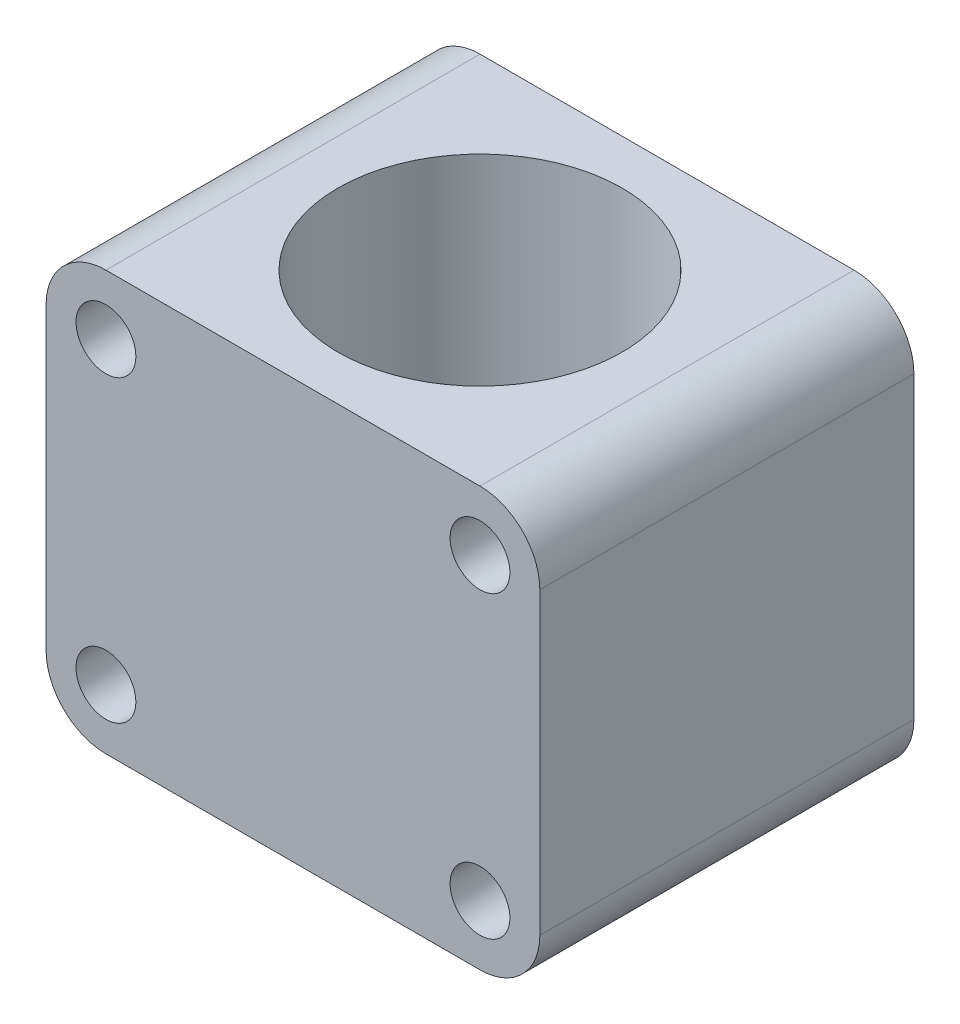
ISO-10303-21;
HEADER;
FILE_DESCRIPTION(('STEP AP214'),'2;1');
FILE_NAME('part.step','',(''),(''),'','','');
FILE_SCHEMA(('AUTOMOTIVE_DESIGN { 1 0 10303 214 1 1 1 1 }'));
ENDSEC;
DATA;
#1=APPLICATION_CONTEXT('core data for automotive mechanical design processes');
#2=APPLICATION_PROTOCOL_DEFINITION('international standard','automotive_design',2000,#1);
#3=PRODUCT_CONTEXT('',#1,'mechanical');
#4=PRODUCT('Part','Part','',(#3));
#5=PRODUCT_RELATED_PRODUCT_CATEGORY('part','',(#4));
#6=PRODUCT_DEFINITION_FORMATION('','',#4);
#7=PRODUCT_DEFINITION_CONTEXT('part definition',#1,'design');
#8=PRODUCT_DEFINITION('design','',#6,#7);
#9=PRODUCT_DEFINITION_SHAPE('','',#8);
#10=(LENGTH_UNIT() NAMED_UNIT(*) SI_UNIT(.MILLI.,.METRE.));
#11=(NAMED_UNIT(*) PLANE_ANGLE_UNIT() SI_UNIT($,.RADIAN.));
#12=(NAMED_UNIT(*) SI_UNIT($,.STERADIAN.) SOLID_ANGLE_UNIT());
#13=UNCERTAINTY_MEASURE_WITH_UNIT(LENGTH_MEASURE(1.E-05),#10,'distance_accuracy_value','');
#14=(GEOMETRIC_REPRESENTATION_CONTEXT(3) GLOBAL_UNCERTAINTY_ASSIGNED_CONTEXT((#13)) GLOBAL_UNIT_ASSIGNED_CONTEXT((#10,
#11,#12)) REPRESENTATION_CONTEXT('',''));
#15=CARTESIAN_POINT('',(0.,0.,0.));
#16=DIRECTION('',(0.,0.,1.));
#17=DIRECTION('',(1.,0.,0.));
#18=AXIS2_PLACEMENT_3D('',#15,#16,#17);
#19=CARTESIAN_POINT('',(0.,0.,25.));
#20=DIRECTION('',(0.,0.,1.));
#21=DIRECTION('',(1.,0.,0.));
#22=AXIS2_PLACEMENT_3D('',#19,#20,#21);
#23=PLANE('',#22);
#24=CARTESIAN_POINT('',(-12.5,10.,25.));
#25=DIRECTION('',(0.,0.,1.));
#26=DIRECTION('',(1.,0.,0.));
#27=AXIS2_PLACEMENT_3D('',#24,#25,#26);
#28=CIRCLE('',#27,2.);
#29=CARTESIAN_POINT('',(-10.5,10.,25.));
#30=VERTEX_POINT('',#29);
#31=EDGE_CURVE('E192',#30,#30,#28,.T.);
#32=ORIENTED_EDGE('',*,*,#31,.F.);
#33=EDGE_LOOP('',(#32));
#34=FACE_BOUND('',#33,.T.);
#35=CARTESIAN_POINT('',(12.5,-10.,25.));
#36=DIRECTION('',(0.,0.,1.));
#37=DIRECTION('',(1.,0.,0.));
#38=AXIS2_PLACEMENT_3D('',#35,#36,#37);
#39=CIRCLE('',#38,2.);
#40=CARTESIAN_POINT('',(14.5,-10.,25.));
#41=VERTEX_POINT('',#40);
#42=EDGE_CURVE('E176',#41,#41,#39,.T.);
#43=ORIENTED_EDGE('',*,*,#42,.F.);
#44=EDGE_LOOP('',(#43));
#45=FACE_BOUND('',#44,.T.);
#46=DIRECTION('',(0.,-1.,0.));
#47=VECTOR('',#46,1.);
#48=CARTESIAN_POINT('',(-16.5,14.,25.));
#49=LINE('',#48,#47);
#50=CARTESIAN_POINT('',(-16.5,9.99999999999999,25.));
#51=VERTEX_POINT('',#50);
#52=CARTESIAN_POINT('',(-16.5,-10.,25.));
#53=VERTEX_POINT('',#52);
#54=EDGE_CURVE('E180',#51,#53,#49,.T.);
#55=ORIENTED_EDGE('',*,*,#54,.T.);
#56=CARTESIAN_POINT('',(-12.5,-10.,25.));
#57=DIRECTION('',(0.,0.,1.));
#58=DIRECTION('',(1.,0.,0.));
#59=AXIS2_PLACEMENT_3D('',#56,#57,#58);
#60=CIRCLE('',#59,4.);
#61=CARTESIAN_POINT('',(-12.5,-14.,25.));
#62=VERTEX_POINT('',#61);
#63=EDGE_CURVE('E157',#53,#62,#60,.T.);
#64=ORIENTED_EDGE('',*,*,#63,.T.);
#65=DIRECTION('',(1.,0.,0.));
#66=VECTOR('',#65,1.);
#67=CARTESIAN_POINT('',(-16.5,-14.,25.));
#68=LINE('',#67,#66);
#69=CARTESIAN_POINT('',(12.5,-14.,25.));
#70=VERTEX_POINT('',#69);
#71=EDGE_CURVE('E128',#62,#70,#68,.T.);
#72=ORIENTED_EDGE('',*,*,#71,.T.);
#73=CARTESIAN_POINT('',(12.5,-10.,25.));
#74=DIRECTION('',(0.,0.,1.));
#75=DIRECTION('',(1.,0.,0.));
#76=AXIS2_PLACEMENT_3D('',#73,#74,#75);
#77=CIRCLE('',#76,4.);
#78=CARTESIAN_POINT('',(16.5,-10.,25.));
#79=VERTEX_POINT('',#78);
#80=EDGE_CURVE('E153',#70,#79,#77,.T.);
#81=ORIENTED_EDGE('',*,*,#80,.T.);
#82=DIRECTION('',(0.,1.,0.));
#83=VECTOR('',#82,1.);
#84=CARTESIAN_POINT('',(16.5,14.,25.));
#85=LINE('',#84,#83);
#86=CARTESIAN_POINT('',(16.5,10.,25.));
#87=VERTEX_POINT('',#86);
#88=EDGE_CURVE('E136',#79,#87,#85,.T.);
#89=ORIENTED_EDGE('',*,*,#88,.T.);
#90=CARTESIAN_POINT('',(12.5,10.,25.));
#91=DIRECTION('',(0.,0.,1.));
#92=DIRECTION('',(1.,0.,0.));
#93=AXIS2_PLACEMENT_3D('',#90,#91,#92);
#94=CIRCLE('',#93,4.);
#95=CARTESIAN_POINT('',(12.5,14.,25.));
#96=VERTEX_POINT('',#95);
#97=EDGE_CURVE('E63',#87,#96,#94,.T.);
#98=ORIENTED_EDGE('',*,*,#97,.T.);
#99=DIRECTION('',(-1.,0.,0.));
#100=VECTOR('',#99,1.);
#101=CARTESIAN_POINT('',(-16.5,14.,25.));
#102=LINE('',#101,#100);
#103=CARTESIAN_POINT('',(-12.5,14.,25.));
#104=VERTEX_POINT('',#103);
#105=EDGE_CURVE('E139',#96,#104,#102,.T.);
#106=ORIENTED_EDGE('',*,*,#105,.T.);
#107=CARTESIAN_POINT('',(-12.5,9.99999999999999,25.));
#108=DIRECTION('',(0.,0.,1.));
#109=DIRECTION('',(1.,0.,0.));
#110=AXIS2_PLACEMENT_3D('',#107,#108,#109);
#111=CIRCLE('',#110,4.);
#112=EDGE_CURVE('E155',#104,#51,#111,.T.);
#113=ORIENTED_EDGE('',*,*,#112,.T.);
#114=EDGE_LOOP('',(#55,#64,#72,#81,#89,#98,#106,#113));
#115=FACE_BOUND('',#114,.T.);
#116=CARTESIAN_POINT('',(-12.5,-10.,25.));
#117=DIRECTION('',(0.,0.,1.));
#118=DIRECTION('',(1.,0.,0.));
#119=AXIS2_PLACEMENT_3D('',#116,#117,#118);
#120=CIRCLE('',#119,2.);
#121=CARTESIAN_POINT('',(-10.5,-10.,25.));
#122=VERTEX_POINT('',#121);
#123=EDGE_CURVE('E186',#122,#122,#120,.T.);
#124=ORIENTED_EDGE('',*,*,#123,.F.);
#125=EDGE_LOOP('',(#124));
#126=FACE_BOUND('',#125,.T.);
#127=CARTESIAN_POINT('',(12.5,10.,25.));
#128=DIRECTION('',(0.,0.,1.));
#129=DIRECTION('',(1.,0.,0.));
#130=AXIS2_PLACEMENT_3D('',#127,#128,#129);
#131=CIRCLE('',#130,2.);
#132=CARTESIAN_POINT('',(14.5,10.,25.));
#133=VERTEX_POINT('',#132);
#134=EDGE_CURVE('E198',#133,#133,#131,.T.);
#135=ORIENTED_EDGE('',*,*,#134,.F.);
#136=EDGE_LOOP('',(#135));
#137=FACE_BOUND('',#136,.T.);
#138=ADVANCED_FACE('F41',(#34,#45,#115,#126,#137),#23,.T.);
#139=CARTESIAN_POINT('',(0.,0.,0.));
#140=DIRECTION('',(0.,0.,1.));
#141=DIRECTION('',(1.,0.,0.));
#142=AXIS2_PLACEMENT_3D('',#139,#140,#141);
#143=PLANE('',#142);
#144=DIRECTION('',(1.,0.,0.));
#145=VECTOR('',#144,1.);
#146=CARTESIAN_POINT('',(-16.5,-14.,0.));
#147=LINE('',#146,#145);
#148=CARTESIAN_POINT('',(-12.5,-14.,0.));
#149=VERTEX_POINT('',#148);
#150=CARTESIAN_POINT('',(12.5,-14.,0.));
#151=VERTEX_POINT('',#150);
#152=EDGE_CURVE('E125',#149,#151,#147,.T.);
#153=ORIENTED_EDGE('',*,*,#152,.F.);
#154=CARTESIAN_POINT('',(-12.5,-10.,0.));
#155=DIRECTION('',(0.,0.,1.));
#156=DIRECTION('',(1.,0.,0.));
#157=AXIS2_PLACEMENT_3D('',#154,#155,#156);
#158=CIRCLE('',#157,4.);
#159=CARTESIAN_POINT('',(-16.5,-10.,0.));
#160=VERTEX_POINT('',#159);
#161=EDGE_CURVE('E108',#149,#160,#158,.F.);
#162=ORIENTED_EDGE('',*,*,#161,.T.);
#163=DIRECTION('',(0.,-1.,0.));
#164=VECTOR('',#163,1.);
#165=CARTESIAN_POINT('',(-16.5,14.,0.));
#166=LINE('',#165,#164);
#167=CARTESIAN_POINT('',(-16.5,9.99999999999999,0.));
#168=VERTEX_POINT('',#167);
#169=EDGE_CURVE('E137',#168,#160,#166,.T.);
#170=ORIENTED_EDGE('',*,*,#169,.F.);
#171=CARTESIAN_POINT('',(-12.5,9.99999999999999,0.));
#172=DIRECTION('',(0.,0.,1.));
#173=DIRECTION('',(1.,0.,0.));
#174=AXIS2_PLACEMENT_3D('',#171,#172,#173);
#175=CIRCLE('',#174,4.);
#176=CARTESIAN_POINT('',(-12.5,14.,0.));
#177=VERTEX_POINT('',#176);
#178=EDGE_CURVE('E119',#168,#177,#175,.F.);
#179=ORIENTED_EDGE('',*,*,#178,.T.);
#180=DIRECTION('',(-1.,0.,0.));
#181=VECTOR('',#180,1.);
#182=CARTESIAN_POINT('',(-16.5,14.,0.));
#183=LINE('',#182,#181);
#184=CARTESIAN_POINT('',(12.5,14.,0.));
#185=VERTEX_POINT('',#184);
#186=EDGE_CURVE('E141',#185,#177,#183,.T.);
#187=ORIENTED_EDGE('',*,*,#186,.F.);
#188=CARTESIAN_POINT('',(12.5,10.,0.));
#189=DIRECTION('',(0.,0.,1.));
#190=DIRECTION('',(1.,0.,0.));
#191=AXIS2_PLACEMENT_3D('',#188,#189,#190);
#192=CIRCLE('',#191,4.);
#193=CARTESIAN_POINT('',(16.5,10.,0.));
#194=VERTEX_POINT('',#193);
#195=EDGE_CURVE('E129',#185,#194,#192,.F.);
#196=ORIENTED_EDGE('',*,*,#195,.T.);
#197=DIRECTION('',(0.,1.,0.));
#198=VECTOR('',#197,1.);
#199=CARTESIAN_POINT('',(16.5,14.,0.));
#200=LINE('',#199,#198);
#201=CARTESIAN_POINT('',(16.5,-10.,0.));
#202=VERTEX_POINT('',#201);
#203=EDGE_CURVE('E168',#202,#194,#200,.T.);
#204=ORIENTED_EDGE('',*,*,#203,.F.);
#205=CARTESIAN_POINT('',(12.5,-10.,0.));
#206=DIRECTION('',(0.,0.,1.));
#207=DIRECTION('',(1.,0.,0.));
#208=AXIS2_PLACEMENT_3D('',#205,#206,#207);
#209=CIRCLE('',#208,4.);
#210=EDGE_CURVE('E135',#202,#151,#209,.F.);
#211=ORIENTED_EDGE('',*,*,#210,.T.);
#212=EDGE_LOOP('',(#153,#162,#170,#179,#187,#196,#204,#211));
#213=FACE_BOUND('',#212,.T.);
#214=CARTESIAN_POINT('',(12.5,-10.,0.));
#215=DIRECTION('',(0.,0.,1.));
#216=DIRECTION('',(1.,0.,0.));
#217=AXIS2_PLACEMENT_3D('',#214,#215,#216);
#218=CIRCLE('',#217,2.);
#219=CARTESIAN_POINT('',(14.5,-10.,0.));
#220=VERTEX_POINT('',#219);
#221=EDGE_CURVE('E183',#220,#220,#218,.T.);
#222=ORIENTED_EDGE('',*,*,#221,.T.);
#223=EDGE_LOOP('',(#222));
#224=FACE_BOUND('',#223,.T.);
#225=CARTESIAN_POINT('',(-12.5,-10.,0.));
#226=DIRECTION('',(0.,0.,1.));
#227=DIRECTION('',(1.,0.,0.));
#228=AXIS2_PLACEMENT_3D('',#225,#226,#227);
#229=CIRCLE('',#228,2.);
#230=CARTESIAN_POINT('',(-10.5,-10.,0.));
#231=VERTEX_POINT('',#230);
#232=EDGE_CURVE('E189',#231,#231,#229,.T.);
#233=ORIENTED_EDGE('',*,*,#232,.T.);
#234=EDGE_LOOP('',(#233));
#235=FACE_BOUND('',#234,.T.);
#236=CARTESIAN_POINT('',(-12.5,10.,0.));
#237=DIRECTION('',(0.,0.,1.));
#238=DIRECTION('',(1.,0.,0.));
#239=AXIS2_PLACEMENT_3D('',#236,#237,#238);
#240=CIRCLE('',#239,2.);
#241=CARTESIAN_POINT('',(-10.5,10.,0.));
#242=VERTEX_POINT('',#241);
#243=EDGE_CURVE('E195',#242,#242,#240,.T.);
#244=ORIENTED_EDGE('',*,*,#243,.T.);
#245=EDGE_LOOP('',(#244));
#246=FACE_BOUND('',#245,.T.);
#247=CARTESIAN_POINT('',(12.5,10.,0.));
#248=DIRECTION('',(0.,0.,1.));
#249=DIRECTION('',(1.,0.,0.));
#250=AXIS2_PLACEMENT_3D('',#247,#248,#249);
#251=CIRCLE('',#250,2.);
#252=CARTESIAN_POINT('',(14.5,10.,0.));
#253=VERTEX_POINT('',#252);
#254=EDGE_CURVE('E201',#253,#253,#251,.T.);
#255=ORIENTED_EDGE('',*,*,#254,.T.);
#256=EDGE_LOOP('',(#255));
#257=FACE_BOUND('',#256,.T.);
#258=ADVANCED_FACE('F132',(#213,#224,#235,#246,#257),#143,.F.);
#259=CARTESIAN_POINT('',(16.5,14.,25.));
#260=DIRECTION('',(-1.,0.,0.));
#261=DIRECTION('',(0.,-1.,0.));
#262=AXIS2_PLACEMENT_3D('',#259,#260,#261);
#263=PLANE('',#262);
#264=ORIENTED_EDGE('',*,*,#88,.F.);
#265=DIRECTION('',(0.,0.,-1.));
#266=VECTOR('',#265,1.);
#267=CARTESIAN_POINT('',(16.5,-10.,25.));
#268=LINE('',#267,#266);
#269=EDGE_CURVE('E11',#79,#202,#268,.T.);
#270=ORIENTED_EDGE('',*,*,#269,.T.);
#271=ORIENTED_EDGE('',*,*,#203,.T.);
#272=DIRECTION('',(0.,0.,-1.));
#273=VECTOR('',#272,1.);
#274=CARTESIAN_POINT('',(16.5,10.,25.));
#275=LINE('',#274,#273);
#276=EDGE_CURVE('E49',#194,#87,#275,.F.);
#277=ORIENTED_EDGE('',*,*,#276,.T.);
#278=EDGE_LOOP('',(#264,#270,#271,#277));
#279=FACE_BOUND('',#278,.T.);
#280=ADVANCED_FACE('F166',(#279),#263,.F.);
#281=CARTESIAN_POINT('',(-16.5,14.,25.));
#282=DIRECTION('',(0.,-1.,0.));
#283=DIRECTION('',(1.,0.,0.));
#284=AXIS2_PLACEMENT_3D('',#281,#282,#283);
#285=PLANE('',#284);
#286=CARTESIAN_POINT('',(0.,14.,12.5));
#287=DIRECTION('',(0.,1.,0.));
#288=DIRECTION('',(-1.,0.,0.));
#289=AXIS2_PLACEMENT_3D('',#286,#287,#288);
#290=CIRCLE('',#289,9.5);
#291=CARTESIAN_POINT('',(-9.5,14.,12.5));
#292=VERTEX_POINT('',#291);
#293=EDGE_CURVE('E207',#292,#292,#290,.T.);
#294=ORIENTED_EDGE('',*,*,#293,.F.);
#295=EDGE_LOOP('',(#294));
#296=FACE_BOUND('',#295,.T.);
#297=ORIENTED_EDGE('',*,*,#186,.T.);
#298=DIRECTION('',(0.,0.,-1.));
#299=VECTOR('',#298,1.);
#300=CARTESIAN_POINT('',(-12.5,14.,25.));
#301=LINE('',#300,#299);
#302=EDGE_CURVE('E56',#177,#104,#301,.F.);
#303=ORIENTED_EDGE('',*,*,#302,.T.);
#304=ORIENTED_EDGE('',*,*,#105,.F.);
#305=DIRECTION('',(0.,0.,-1.));
#306=VECTOR('',#305,1.);
#307=CARTESIAN_POINT('',(12.5,14.,25.));
#308=LINE('',#307,#306);
#309=EDGE_CURVE('E159',#96,#185,#308,.T.);
#310=ORIENTED_EDGE('',*,*,#309,.T.);
#311=EDGE_LOOP('',(#297,#303,#304,#310));
#312=FACE_BOUND('',#311,.T.);
#313=ADVANCED_FACE('F175',(#296,#312),#285,.F.);
#314=CARTESIAN_POINT('',(-16.5,14.,25.));
#315=DIRECTION('',(1.,0.,0.));
#316=DIRECTION('',(0.,1.,0.));
#317=AXIS2_PLACEMENT_3D('',#314,#315,#316);
#318=PLANE('',#317);
#319=ORIENTED_EDGE('',*,*,#169,.T.);
#320=DIRECTION('',(0.,0.,-1.));
#321=VECTOR('',#320,1.);
#322=CARTESIAN_POINT('',(-16.5,-10.,25.));
#323=LINE('',#322,#321);
#324=EDGE_CURVE('E113',#160,#53,#323,.F.);
#325=ORIENTED_EDGE('',*,*,#324,.T.);
#326=ORIENTED_EDGE('',*,*,#54,.F.);
#327=DIRECTION('',(0.,0.,-1.));
#328=VECTOR('',#327,1.);
#329=CARTESIAN_POINT('',(-16.5,9.99999999999999,25.));
#330=LINE('',#329,#328);
#331=EDGE_CURVE('E118',#51,#168,#330,.T.);
#332=ORIENTED_EDGE('',*,*,#331,.T.);
#333=EDGE_LOOP('',(#319,#325,#326,#332));
#334=FACE_BOUND('',#333,.T.);
#335=ADVANCED_FACE('F221',(#334),#318,.F.);
#336=CARTESIAN_POINT('',(-16.5,-14.,25.));
#337=DIRECTION('',(0.,1.,0.));
#338=DIRECTION('',(0.,0.,1.));
#339=AXIS2_PLACEMENT_3D('',#336,#337,#338);
#340=PLANE('',#339);
#341=CARTESIAN_POINT('',(0.,-14.,12.5));
#342=DIRECTION('',(0.,1.,0.));
#343=DIRECTION('',(-1.,0.,0.));
#344=AXIS2_PLACEMENT_3D('',#341,#342,#343);
#345=CIRCLE('',#344,9.5);
#346=CARTESIAN_POINT('',(-9.5,-14.,12.5));
#347=VERTEX_POINT('',#346);
#348=EDGE_CURVE('E204',#347,#347,#345,.T.);
#349=ORIENTED_EDGE('',*,*,#348,.T.);
#350=EDGE_LOOP('',(#349));
#351=FACE_BOUND('',#350,.T.);
#352=ORIENTED_EDGE('',*,*,#71,.F.);
#353=DIRECTION('',(0.,0.,-1.));
#354=VECTOR('',#353,1.);
#355=CARTESIAN_POINT('',(-12.5,-14.,25.));
#356=LINE('',#355,#354);
#357=EDGE_CURVE('E112',#62,#149,#356,.T.);
#358=ORIENTED_EDGE('',*,*,#357,.T.);
#359=ORIENTED_EDGE('',*,*,#152,.T.);
#360=DIRECTION('',(0.,0.,-1.));
#361=VECTOR('',#360,1.);
#362=CARTESIAN_POINT('',(12.5,-14.,25.));
#363=LINE('',#362,#361);
#364=EDGE_CURVE('E130',#151,#70,#363,.F.);
#365=ORIENTED_EDGE('',*,*,#364,.T.);
#366=EDGE_LOOP('',(#352,#358,#359,#365));
#367=FACE_BOUND('',#366,.T.);
#368=ADVANCED_FACE('F124',(#351,#367),#340,.F.);
#369=CARTESIAN_POINT('',(12.5,-10.,25.));
#370=DIRECTION('',(0.,0.,-1.));
#371=DIRECTION('',(-1.,0.,0.));
#372=AXIS2_PLACEMENT_3D('',#369,#370,#371);
#373=CYLINDRICAL_SURFACE('',#372,2.);
#374=ORIENTED_EDGE('',*,*,#42,.T.);
#375=EDGE_LOOP('',(#374));
#376=FACE_BOUND('',#375,.T.);
#377=ORIENTED_EDGE('',*,*,#221,.F.);
#378=EDGE_LOOP('',(#377));
#379=FACE_BOUND('',#378,.T.);
#380=ADVANCED_FACE('F240',(#376,#379),#373,.F.);
#381=CARTESIAN_POINT('',(-12.5,-10.,25.));
#382=DIRECTION('',(0.,0.,-1.));
#383=DIRECTION('',(-1.,0.,0.));
#384=AXIS2_PLACEMENT_3D('',#381,#382,#383);
#385=CYLINDRICAL_SURFACE('',#384,2.);
#386=ORIENTED_EDGE('',*,*,#123,.T.);
#387=EDGE_LOOP('',(#386));
#388=FACE_BOUND('',#387,.T.);
#389=ORIENTED_EDGE('',*,*,#232,.F.);
#390=EDGE_LOOP('',(#389));
#391=FACE_BOUND('',#390,.T.);
#392=ADVANCED_FACE('F247',(#388,#391),#385,.F.);
#393=CARTESIAN_POINT('',(-12.5,10.,25.));
#394=DIRECTION('',(0.,0.,-1.));
#395=DIRECTION('',(-1.,0.,0.));
#396=AXIS2_PLACEMENT_3D('',#393,#394,#395);
#397=CYLINDRICAL_SURFACE('',#396,2.);
#398=ORIENTED_EDGE('',*,*,#31,.T.);
#399=EDGE_LOOP('',(#398));
#400=FACE_BOUND('',#399,.T.);
#401=ORIENTED_EDGE('',*,*,#243,.F.);
#402=EDGE_LOOP('',(#401));
#403=FACE_BOUND('',#402,.T.);
#404=ADVANCED_FACE('F252',(#400,#403),#397,.F.);
#405=CARTESIAN_POINT('',(12.5,10.,25.));
#406=DIRECTION('',(0.,0.,-1.));
#407=DIRECTION('',(-1.,0.,0.));
#408=AXIS2_PLACEMENT_3D('',#405,#406,#407);
#409=CYLINDRICAL_SURFACE('',#408,2.);
#410=ORIENTED_EDGE('',*,*,#134,.T.);
#411=EDGE_LOOP('',(#410));
#412=FACE_BOUND('',#411,.T.);
#413=ORIENTED_EDGE('',*,*,#254,.F.);
#414=EDGE_LOOP('',(#413));
#415=FACE_BOUND('',#414,.T.);
#416=ADVANCED_FACE('F264',(#412,#415),#409,.F.);
#417=CARTESIAN_POINT('',(-12.5,-10.,25.));
#418=DIRECTION('',(0.,0.,-1.));
#419=DIRECTION('',(-1.,0.,0.));
#420=AXIS2_PLACEMENT_3D('',#417,#418,#419);
#421=CYLINDRICAL_SURFACE('',#420,4.);
#422=ORIENTED_EDGE('',*,*,#63,.F.);
#423=ORIENTED_EDGE('',*,*,#324,.F.);
#424=ORIENTED_EDGE('',*,*,#161,.F.);
#425=ORIENTED_EDGE('',*,*,#357,.F.);
#426=EDGE_LOOP('',(#422,#423,#424,#425));
#427=FACE_BOUND('',#426,.T.);
#428=ADVANCED_FACE('F111',(#427),#421,.T.);
#429=CARTESIAN_POINT('',(-12.5,9.99999999999999,25.));
#430=DIRECTION('',(0.,0.,-1.));
#431=DIRECTION('',(-1.,0.,0.));
#432=AXIS2_PLACEMENT_3D('',#429,#430,#431);
#433=CYLINDRICAL_SURFACE('',#432,4.);
#434=ORIENTED_EDGE('',*,*,#112,.F.);
#435=ORIENTED_EDGE('',*,*,#302,.F.);
#436=ORIENTED_EDGE('',*,*,#178,.F.);
#437=ORIENTED_EDGE('',*,*,#331,.F.);
#438=EDGE_LOOP('',(#434,#435,#436,#437));
#439=FACE_BOUND('',#438,.T.);
#440=ADVANCED_FACE('F272',(#439),#433,.T.);
#441=CARTESIAN_POINT('',(12.5,-10.,25.));
#442=DIRECTION('',(0.,0.,-1.));
#443=DIRECTION('',(-1.,0.,0.));
#444=AXIS2_PLACEMENT_3D('',#441,#442,#443);
#445=CYLINDRICAL_SURFACE('',#444,4.);
#446=ORIENTED_EDGE('',*,*,#80,.F.);
#447=ORIENTED_EDGE('',*,*,#364,.F.);
#448=ORIENTED_EDGE('',*,*,#210,.F.);
#449=ORIENTED_EDGE('',*,*,#269,.F.);
#450=EDGE_LOOP('',(#446,#447,#448,#449));
#451=FACE_BOUND('',#450,.T.);
#452=ADVANCED_FACE('F360',(#451),#445,.T.);
#453=CARTESIAN_POINT('',(12.5,10.,25.));
#454=DIRECTION('',(0.,0.,-1.));
#455=DIRECTION('',(-1.,0.,0.));
#456=AXIS2_PLACEMENT_3D('',#453,#454,#455);
#457=CYLINDRICAL_SURFACE('',#456,4.);
#458=ORIENTED_EDGE('',*,*,#97,.F.);
#459=ORIENTED_EDGE('',*,*,#276,.F.);
#460=ORIENTED_EDGE('',*,*,#195,.F.);
#461=ORIENTED_EDGE('',*,*,#309,.F.);
#462=EDGE_LOOP('',(#458,#459,#460,#461));
#463=FACE_BOUND('',#462,.T.);
#464=ADVANCED_FACE('F43',(#463),#457,.T.);
#465=CARTESIAN_POINT('',(0.,-14.,12.5));
#466=DIRECTION('',(0.,1.,0.));
#467=DIRECTION('',(-1.,0.,0.));
#468=AXIS2_PLACEMENT_3D('',#465,#466,#467);
#469=CYLINDRICAL_SURFACE('',#468,9.5);
#470=ORIENTED_EDGE('',*,*,#348,.F.);
#471=EDGE_LOOP('',(#470));
#472=FACE_BOUND('',#471,.T.);
#473=ORIENTED_EDGE('',*,*,#293,.T.);
#474=EDGE_LOOP('',(#473));
#475=FACE_BOUND('',#474,.T.);
#476=ADVANCED_FACE('F214',(#472,#475),#469,.F.);
#477=CLOSED_SHELL('',(#138,#258,#280,#313,#335,#368,#380,#392,#404,#416,#428,#440,#452,#464,#476));
#478=MANIFOLD_SOLID_BREP('B2',#477);
#479=ADVANCED_BREP_SHAPE_REPRESENTATION('',(#18,#478),#14);
#480=SHAPE_DEFINITION_REPRESENTATION(#9,#479);
ENDSEC;
END-ISO-10303-21;
